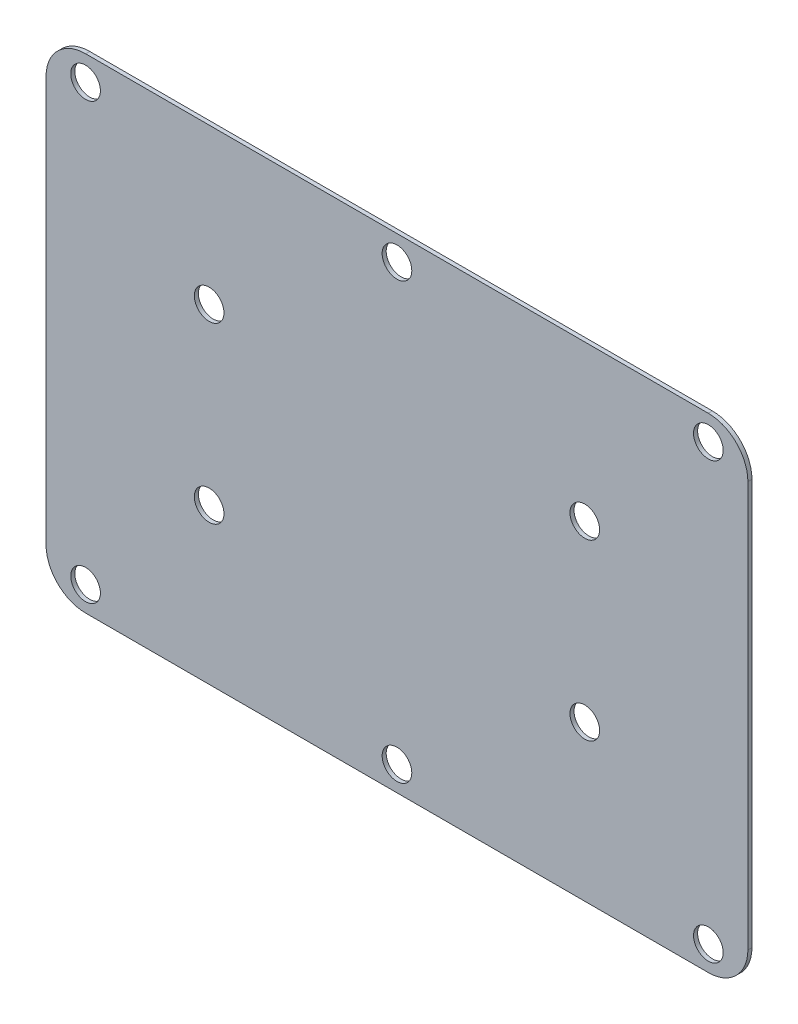
ISO-10303-21;
HEADER;
FILE_DESCRIPTION(('STEP AP214'),'2;1');
FILE_NAME('part.step','',(''),(''),'','','');
FILE_SCHEMA(('AUTOMOTIVE_DESIGN { 1 0 10303 214 1 1 1 1 }'));
ENDSEC;
DATA;
#1=APPLICATION_CONTEXT('core data for automotive mechanical design processes');
#2=APPLICATION_PROTOCOL_DEFINITION('international standard','automotive_design',2000,#1);
#3=PRODUCT_CONTEXT('',#1,'mechanical');
#4=PRODUCT('Part','Part','',(#3));
#5=PRODUCT_RELATED_PRODUCT_CATEGORY('part','',(#4));
#6=PRODUCT_DEFINITION_FORMATION('','',#4);
#7=PRODUCT_DEFINITION_CONTEXT('part definition',#1,'design');
#8=PRODUCT_DEFINITION('design','',#6,#7);
#9=PRODUCT_DEFINITION_SHAPE('','',#8);
#10=(LENGTH_UNIT() NAMED_UNIT(*) SI_UNIT(.MILLI.,.METRE.));
#11=(NAMED_UNIT(*) PLANE_ANGLE_UNIT() SI_UNIT($,.RADIAN.));
#12=(NAMED_UNIT(*) SI_UNIT($,.STERADIAN.) SOLID_ANGLE_UNIT());
#13=UNCERTAINTY_MEASURE_WITH_UNIT(LENGTH_MEASURE(1.E-05),#10,'distance_accuracy_value','');
#14=(GEOMETRIC_REPRESENTATION_CONTEXT(3) GLOBAL_UNCERTAINTY_ASSIGNED_CONTEXT((#13)) GLOBAL_UNIT_ASSIGNED_CONTEXT((#10,
#11,#12)) REPRESENTATION_CONTEXT('',''));
#15=CARTESIAN_POINT('',(0.,0.,0.));
#16=DIRECTION('',(0.,0.,1.));
#17=DIRECTION('',(1.,0.,0.));
#18=AXIS2_PLACEMENT_3D('',#15,#16,#17);
#19=CARTESIAN_POINT('',(-35.5,-20.51300048828,0.));
#20=DIRECTION('',(0.,0.,-1.));
#21=DIRECTION('',(0.,-1.,0.));
#22=AXIS2_PLACEMENT_3D('',#19,#20,#21);
#23=PLANE('',#22);
#24=CARTESIAN_POINT('',(31.5,22.,0.));
#25=DIRECTION('',(0.,0.,1.));
#26=DIRECTION('',(1.,0.,0.));
#27=AXIS2_PLACEMENT_3D('',#24,#25,#26);
#28=CIRCLE('',#27,1.5);
#29=CARTESIAN_POINT('',(33.,22.,0.));
#30=VERTEX_POINT('',#29);
#31=EDGE_CURVE('E30',#30,#30,#28,.T.);
#32=ORIENTED_EDGE('',*,*,#31,.F.);
#33=EDGE_LOOP('',(#32));
#34=FACE_BOUND('',#33,.T.);
#35=CARTESIAN_POINT('',(19.,8.800000190735,0.));
#36=DIRECTION('',(0.,0.,1.));
#37=DIRECTION('',(1.,0.,0.));
#38=AXIS2_PLACEMENT_3D('',#35,#36,#37);
#39=CIRCLE('',#38,1.5);
#40=CARTESIAN_POINT('',(20.5,8.800000190735,0.));
#41=VERTEX_POINT('',#40);
#42=EDGE_CURVE('E220',#41,#41,#39,.T.);
#43=ORIENTED_EDGE('',*,*,#42,.F.);
#44=EDGE_LOOP('',(#43));
#45=FACE_BOUND('',#44,.T.);
#46=CARTESIAN_POINT('',(0.,22.,0.));
#47=DIRECTION('',(0.,0.,1.));
#48=DIRECTION('',(1.,0.,0.));
#49=AXIS2_PLACEMENT_3D('',#46,#47,#48);
#50=CIRCLE('',#49,1.5);
#51=CARTESIAN_POINT('',(1.5,22.,0.));
#52=VERTEX_POINT('',#51);
#53=EDGE_CURVE('E119',#52,#52,#50,.T.);
#54=ORIENTED_EDGE('',*,*,#53,.F.);
#55=EDGE_LOOP('',(#54));
#56=FACE_BOUND('',#55,.T.);
#57=CARTESIAN_POINT('',(31.5,-22.,0.));
#58=DIRECTION('',(0.,0.,1.));
#59=DIRECTION('',(1.,0.,0.));
#60=AXIS2_PLACEMENT_3D('',#57,#58,#59);
#61=CIRCLE('',#60,1.5);
#62=CARTESIAN_POINT('',(33.,-22.,0.));
#63=VERTEX_POINT('',#62);
#64=EDGE_CURVE('E135',#63,#63,#61,.T.);
#65=ORIENTED_EDGE('',*,*,#64,.F.);
#66=EDGE_LOOP('',(#65));
#67=FACE_BOUND('',#66,.T.);
#68=CARTESIAN_POINT('',(19.,-8.800000190735,0.));
#69=DIRECTION('',(0.,0.,1.));
#70=DIRECTION('',(1.,0.,0.));
#71=AXIS2_PLACEMENT_3D('',#68,#69,#70);
#72=CIRCLE('',#71,1.5);
#73=CARTESIAN_POINT('',(20.5,-8.800000190735,0.));
#74=VERTEX_POINT('',#73);
#75=EDGE_CURVE('E333',#74,#74,#72,.T.);
#76=ORIENTED_EDGE('',*,*,#75,.F.);
#77=EDGE_LOOP('',(#76));
#78=FACE_BOUND('',#77,.T.);
#79=CARTESIAN_POINT('',(-19.,8.800000190735,0.));
#80=DIRECTION('',(0.,0.,1.));
#81=DIRECTION('',(1.,0.,0.));
#82=AXIS2_PLACEMENT_3D('',#79,#80,#81);
#83=CIRCLE('',#82,1.5);
#84=CARTESIAN_POINT('',(-17.5,8.800000190735,0.));
#85=VERTEX_POINT('',#84);
#86=EDGE_CURVE('E104',#85,#85,#83,.T.);
#87=ORIENTED_EDGE('',*,*,#86,.F.);
#88=EDGE_LOOP('',(#87));
#89=FACE_BOUND('',#88,.T.);
#90=CARTESIAN_POINT('',(-19.,-8.800000190735,0.));
#91=DIRECTION('',(0.,0.,1.));
#92=DIRECTION('',(1.,0.,0.));
#93=AXIS2_PLACEMENT_3D('',#90,#91,#92);
#94=CIRCLE('',#93,1.5);
#95=CARTESIAN_POINT('',(-17.5,-8.800000190735,0.));
#96=VERTEX_POINT('',#95);
#97=EDGE_CURVE('E197',#96,#96,#94,.T.);
#98=ORIENTED_EDGE('',*,*,#97,.F.);
#99=EDGE_LOOP('',(#98));
#100=FACE_BOUND('',#99,.T.);
#101=CARTESIAN_POINT('',(-31.5,22.,0.));
#102=DIRECTION('',(0.,0.,1.));
#103=DIRECTION('',(1.,0.,0.));
#104=AXIS2_PLACEMENT_3D('',#101,#102,#103);
#105=CIRCLE('',#104,1.5);
#106=CARTESIAN_POINT('',(-30.,22.,0.));
#107=VERTEX_POINT('',#106);
#108=EDGE_CURVE('E231',#107,#107,#105,.T.);
#109=ORIENTED_EDGE('',*,*,#108,.F.);
#110=EDGE_LOOP('',(#109));
#111=FACE_BOUND('',#110,.T.);
#112=CARTESIAN_POINT('',(0.,-22.,0.));
#113=DIRECTION('',(0.,0.,1.));
#114=DIRECTION('',(1.,0.,0.));
#115=AXIS2_PLACEMENT_3D('',#112,#113,#114);
#116=CIRCLE('',#115,1.5);
#117=CARTESIAN_POINT('',(1.5,-22.,0.));
#118=VERTEX_POINT('',#117);
#119=EDGE_CURVE('E176',#118,#118,#116,.T.);
#120=ORIENTED_EDGE('',*,*,#119,.F.);
#121=EDGE_LOOP('',(#120));
#122=FACE_BOUND('',#121,.T.);
#123=CARTESIAN_POINT('',(-31.5,-22.,0.));
#124=DIRECTION('',(0.,0.,1.));
#125=DIRECTION('',(1.,0.,0.));
#126=AXIS2_PLACEMENT_3D('',#123,#124,#125);
#127=CIRCLE('',#126,1.5);
#128=CARTESIAN_POINT('',(-30.,-22.,0.));
#129=VERTEX_POINT('',#128);
#130=EDGE_CURVE('E284',#129,#129,#127,.T.);
#131=ORIENTED_EDGE('',*,*,#130,.F.);
#132=EDGE_LOOP('',(#131));
#133=FACE_BOUND('',#132,.T.);
#134=CARTESIAN_POINT('',(-31.50025073041,-20.50025236553,0.));
#135=DIRECTION('',(0.,0.,1.));
#136=DIRECTION('',(-0.999994920819662,-0.00318721428174392,0.));
#137=AXIS2_PLACEMENT_3D('',#134,#135,#136);
#138=CIRCLE('',#137,3.999769585138);
#139=CARTESIAN_POINT('',(-35.5,-20.51300048828,0.));
#140=VERTEX_POINT('',#139);
#141=CARTESIAN_POINT('',(-31.48699951171,-24.5,0.));
#142=VERTEX_POINT('',#141);
#143=EDGE_CURVE('E285',#140,#142,#138,.T.);
#144=ORIENTED_EDGE('',*,*,#143,.T.);
#145=DIRECTION('',(1.,0.,0.));
#146=VECTOR('',#145,1.);
#147=CARTESIAN_POINT('',(-31.48699951171,-24.5,0.));
#148=LINE('',#147,#146);
#149=CARTESIAN_POINT('',(31.486999511719,-24.5,0.));
#150=VERTEX_POINT('',#149);
#151=EDGE_CURVE('E246',#142,#150,#148,.T.);
#152=ORIENTED_EDGE('',*,*,#151,.T.);
#153=CARTESIAN_POINT('',(31.500250730413,-20.50025236553,0.));
#154=DIRECTION('',(0.,0.,1.));
#155=DIRECTION('',(-0.003312995514305,-0.999994512015302,0.));
#156=AXIS2_PLACEMENT_3D('',#153,#154,#155);
#157=CIRCLE('',#156,3.999769585138);
#158=CARTESIAN_POINT('',(35.5,-20.51300048828,0.));
#159=VERTEX_POINT('',#158);
#160=EDGE_CURVE('E314',#150,#159,#157,.T.);
#161=ORIENTED_EDGE('',*,*,#160,.T.);
#162=DIRECTION('',(0.,1.,0.));
#163=VECTOR('',#162,1.);
#164=CARTESIAN_POINT('',(35.5,-20.51300048828,0.));
#165=LINE('',#164,#163);
#166=CARTESIAN_POINT('',(35.5,20.513000488281,0.));
#167=VERTEX_POINT('',#166);
#168=EDGE_CURVE('E259',#159,#167,#165,.T.);
#169=ORIENTED_EDGE('',*,*,#168,.T.);
#170=CARTESIAN_POINT('',(31.500250730413,20.500252365536,0.));
#171=DIRECTION('',(0.,0.,1.));
#172=DIRECTION('',(0.999994920819662,0.00318721428174392,0.));
#173=AXIS2_PLACEMENT_3D('',#170,#171,#172);
#174=CIRCLE('',#173,3.999769585138);
#175=CARTESIAN_POINT('',(31.486999511719,24.5,0.));
#176=VERTEX_POINT('',#175);
#177=EDGE_CURVE('E215',#167,#176,#174,.T.);
#178=ORIENTED_EDGE('',*,*,#177,.T.);
#179=DIRECTION('',(-1.,0.,0.));
#180=VECTOR('',#179,1.);
#181=CARTESIAN_POINT('',(31.486999511719,24.5,0.));
#182=LINE('',#181,#180);
#183=CARTESIAN_POINT('',(-31.48699951171,24.5,0.));
#184=VERTEX_POINT('',#183);
#185=EDGE_CURVE('E270',#176,#184,#182,.T.);
#186=ORIENTED_EDGE('',*,*,#185,.T.);
#187=CARTESIAN_POINT('',(-31.50025073041,20.500252365536,0.));
#188=DIRECTION('',(0.,0.,1.));
#189=DIRECTION('',(0.003312995514305,0.999994512015302,0.));
#190=AXIS2_PLACEMENT_3D('',#187,#188,#189);
#191=CIRCLE('',#190,3.999769585138);
#192=CARTESIAN_POINT('',(-35.5,20.513000488281,0.));
#193=VERTEX_POINT('',#192);
#194=EDGE_CURVE('E226',#184,#193,#191,.T.);
#195=ORIENTED_EDGE('',*,*,#194,.T.);
#196=DIRECTION('',(0.,-1.,0.));
#197=VECTOR('',#196,1.);
#198=CARTESIAN_POINT('',(-35.5,20.513000488281,0.));
#199=LINE('',#198,#197);
#200=EDGE_CURVE('E225',#193,#140,#199,.T.);
#201=ORIENTED_EDGE('',*,*,#200,.T.);
#202=EDGE_LOOP('',(#144,#152,#161,#169,#178,#186,#195,#201));
#203=FACE_BOUND('',#202,.T.);
#204=ADVANCED_FACE('F19',(#34,#45,#56,#67,#78,#89,#100,#111,#122,#133,#203),#23,.F.);
#205=CARTESIAN_POINT('',(-35.5,-20.51300048828,-0.41148));
#206=DIRECTION('',(0.,0.,-1.));
#207=DIRECTION('',(0.,-1.,0.));
#208=AXIS2_PLACEMENT_3D('',#205,#206,#207);
#209=PLANE('',#208);
#210=CARTESIAN_POINT('',(31.5,22.,-0.41148));
#211=DIRECTION('',(0.,0.,1.));
#212=DIRECTION('',(1.,0.,0.));
#213=AXIS2_PLACEMENT_3D('',#210,#211,#212);
#214=CIRCLE('',#213,1.5);
#215=CARTESIAN_POINT('',(33.,22.,-0.41148));
#216=VERTEX_POINT('',#215);
#217=EDGE_CURVE('E11',#216,#216,#214,.T.);
#218=ORIENTED_EDGE('',*,*,#217,.T.);
#219=EDGE_LOOP('',(#218));
#220=FACE_BOUND('',#219,.T.);
#221=CARTESIAN_POINT('',(19.,8.800000190735,-0.41148));
#222=DIRECTION('',(0.,0.,1.));
#223=DIRECTION('',(1.,0.,0.));
#224=AXIS2_PLACEMENT_3D('',#221,#222,#223);
#225=CIRCLE('',#224,1.5);
#226=CARTESIAN_POINT('',(20.5,8.800000190735,-0.41148));
#227=VERTEX_POINT('',#226);
#228=EDGE_CURVE('E251',#227,#227,#225,.T.);
#229=ORIENTED_EDGE('',*,*,#228,.T.);
#230=EDGE_LOOP('',(#229));
#231=FACE_BOUND('',#230,.T.);
#232=CARTESIAN_POINT('',(0.,22.,-0.41148));
#233=DIRECTION('',(0.,0.,1.));
#234=DIRECTION('',(1.,0.,0.));
#235=AXIS2_PLACEMENT_3D('',#232,#233,#234);
#236=CIRCLE('',#235,1.5);
#237=CARTESIAN_POINT('',(1.5,22.,-0.41148));
#238=VERTEX_POINT('',#237);
#239=EDGE_CURVE('E128',#238,#238,#236,.T.);
#240=ORIENTED_EDGE('',*,*,#239,.T.);
#241=EDGE_LOOP('',(#240));
#242=FACE_BOUND('',#241,.T.);
#243=CARTESIAN_POINT('',(31.5,-22.,-0.41148));
#244=DIRECTION('',(0.,0.,1.));
#245=DIRECTION('',(1.,0.,0.));
#246=AXIS2_PLACEMENT_3D('',#243,#244,#245);
#247=CIRCLE('',#246,1.5);
#248=CARTESIAN_POINT('',(33.,-22.,-0.41148));
#249=VERTEX_POINT('',#248);
#250=EDGE_CURVE('E23',#249,#249,#247,.T.);
#251=ORIENTED_EDGE('',*,*,#250,.T.);
#252=EDGE_LOOP('',(#251));
#253=FACE_BOUND('',#252,.T.);
#254=CARTESIAN_POINT('',(19.,-8.800000190735,-0.41148));
#255=DIRECTION('',(0.,0.,1.));
#256=DIRECTION('',(1.,0.,0.));
#257=AXIS2_PLACEMENT_3D('',#254,#255,#256);
#258=CIRCLE('',#257,1.5);
#259=CARTESIAN_POINT('',(20.5,-8.800000190735,-0.41148));
#260=VERTEX_POINT('',#259);
#261=EDGE_CURVE('E93',#260,#260,#258,.T.);
#262=ORIENTED_EDGE('',*,*,#261,.T.);
#263=EDGE_LOOP('',(#262));
#264=FACE_BOUND('',#263,.T.);
#265=CARTESIAN_POINT('',(-19.,8.800000190735,-0.41148));
#266=DIRECTION('',(0.,0.,1.));
#267=DIRECTION('',(1.,0.,0.));
#268=AXIS2_PLACEMENT_3D('',#265,#266,#267);
#269=CIRCLE('',#268,1.5);
#270=CARTESIAN_POINT('',(-17.5,8.800000190735,-0.41148));
#271=VERTEX_POINT('',#270);
#272=EDGE_CURVE('E289',#271,#271,#269,.T.);
#273=ORIENTED_EDGE('',*,*,#272,.T.);
#274=EDGE_LOOP('',(#273));
#275=FACE_BOUND('',#274,.T.);
#276=CARTESIAN_POINT('',(-19.,-8.800000190735,-0.41148));
#277=DIRECTION('',(0.,0.,1.));
#278=DIRECTION('',(1.,0.,0.));
#279=AXIS2_PLACEMENT_3D('',#276,#277,#278);
#280=CIRCLE('',#279,1.5);
#281=CARTESIAN_POINT('',(-17.5,-8.800000190735,-0.41148));
#282=VERTEX_POINT('',#281);
#283=EDGE_CURVE('E190',#282,#282,#280,.T.);
#284=ORIENTED_EDGE('',*,*,#283,.T.);
#285=EDGE_LOOP('',(#284));
#286=FACE_BOUND('',#285,.T.);
#287=CARTESIAN_POINT('',(-31.5,22.,-0.41148));
#288=DIRECTION('',(0.,0.,1.));
#289=DIRECTION('',(1.,0.,0.));
#290=AXIS2_PLACEMENT_3D('',#287,#288,#289);
#291=CIRCLE('',#290,1.5);
#292=CARTESIAN_POINT('',(-30.,22.,-0.41148));
#293=VERTEX_POINT('',#292);
#294=EDGE_CURVE('E162',#293,#293,#291,.T.);
#295=ORIENTED_EDGE('',*,*,#294,.T.);
#296=EDGE_LOOP('',(#295));
#297=FACE_BOUND('',#296,.T.);
#298=CARTESIAN_POINT('',(0.,-22.,-0.41148));
#299=DIRECTION('',(0.,0.,1.));
#300=DIRECTION('',(1.,0.,0.));
#301=AXIS2_PLACEMENT_3D('',#298,#299,#300);
#302=CIRCLE('',#301,1.5);
#303=CARTESIAN_POINT('',(1.5,-22.,-0.41148));
#304=VERTEX_POINT('',#303);
#305=EDGE_CURVE('E232',#304,#304,#302,.T.);
#306=ORIENTED_EDGE('',*,*,#305,.T.);
#307=EDGE_LOOP('',(#306));
#308=FACE_BOUND('',#307,.T.);
#309=CARTESIAN_POINT('',(-31.5,-22.,-0.41148));
#310=DIRECTION('',(0.,0.,1.));
#311=DIRECTION('',(1.,0.,0.));
#312=AXIS2_PLACEMENT_3D('',#309,#310,#311);
#313=CIRCLE('',#312,1.5);
#314=CARTESIAN_POINT('',(-30.,-22.,-0.41148));
#315=VERTEX_POINT('',#314);
#316=EDGE_CURVE('E239',#315,#315,#313,.T.);
#317=ORIENTED_EDGE('',*,*,#316,.T.);
#318=EDGE_LOOP('',(#317));
#319=FACE_BOUND('',#318,.T.);
#320=DIRECTION('',(0.,-1.,0.));
#321=VECTOR('',#320,1.);
#322=CARTESIAN_POINT('',(-35.5,20.513000488281,-0.41148));
#323=LINE('',#322,#321);
#324=CARTESIAN_POINT('',(-35.5,20.513000488281,-0.41148));
#325=VERTEX_POINT('',#324);
#326=CARTESIAN_POINT('',(-35.5,-20.51300048828,-0.41148));
#327=VERTEX_POINT('',#326);
#328=EDGE_CURVE('E221',#325,#327,#323,.T.);
#329=ORIENTED_EDGE('',*,*,#328,.F.);
#330=CARTESIAN_POINT('',(-31.50025073041,20.500252365536,-0.41148));
#331=DIRECTION('',(0.,0.,1.));
#332=DIRECTION('',(0.003312995514305,0.999994512015302,0.));
#333=AXIS2_PLACEMENT_3D('',#330,#331,#332);
#334=CIRCLE('',#333,3.999769585138);
#335=CARTESIAN_POINT('',(-31.48699951171,24.5,-0.41148));
#336=VERTEX_POINT('',#335);
#337=EDGE_CURVE('E265',#336,#325,#334,.T.);
#338=ORIENTED_EDGE('',*,*,#337,.F.);
#339=DIRECTION('',(-1.,0.,0.));
#340=VECTOR('',#339,1.);
#341=CARTESIAN_POINT('',(31.486999511719,24.5,-0.41148));
#342=LINE('',#341,#340);
#343=CARTESIAN_POINT('',(31.486999511719,24.5,-0.41148));
#344=VERTEX_POINT('',#343);
#345=EDGE_CURVE('E211',#344,#336,#342,.T.);
#346=ORIENTED_EDGE('',*,*,#345,.F.);
#347=CARTESIAN_POINT('',(31.500250730413,20.500252365536,-0.41148));
#348=DIRECTION('',(0.,0.,1.));
#349=DIRECTION('',(0.999994920819662,0.00318721428174392,0.));
#350=AXIS2_PLACEMENT_3D('',#347,#348,#349);
#351=CIRCLE('',#350,3.999769585138);
#352=CARTESIAN_POINT('',(35.5,20.513000488281,-0.41148));
#353=VERTEX_POINT('',#352);
#354=EDGE_CURVE('E264',#353,#344,#351,.T.);
#355=ORIENTED_EDGE('',*,*,#354,.F.);
#356=DIRECTION('',(0.,1.,0.));
#357=VECTOR('',#356,1.);
#358=CARTESIAN_POINT('',(35.5,-20.51300048828,-0.41148));
#359=LINE('',#358,#357);
#360=CARTESIAN_POINT('',(35.5,-20.51300048828,-0.41148));
#361=VERTEX_POINT('',#360);
#362=EDGE_CURVE('E260',#361,#353,#359,.T.);
#363=ORIENTED_EDGE('',*,*,#362,.F.);
#364=CARTESIAN_POINT('',(31.500250730413,-20.50025236553,-0.41148));
#365=DIRECTION('',(0.,0.,1.));
#366=DIRECTION('',(-0.003312995514305,-0.999994512015302,0.));
#367=AXIS2_PLACEMENT_3D('',#364,#365,#366);
#368=CIRCLE('',#367,3.999769585138);
#369=CARTESIAN_POINT('',(31.486999511719,-24.5,-0.41148));
#370=VERTEX_POINT('',#369);
#371=EDGE_CURVE('E315',#370,#361,#368,.T.);
#372=ORIENTED_EDGE('',*,*,#371,.F.);
#373=DIRECTION('',(1.,0.,0.));
#374=VECTOR('',#373,1.);
#375=CARTESIAN_POINT('',(-31.48699951171,-24.5,-0.41148));
#376=LINE('',#375,#374);
#377=CARTESIAN_POINT('',(-31.48699951171,-24.5,-0.41148));
#378=VERTEX_POINT('',#377);
#379=EDGE_CURVE('E247',#378,#370,#376,.T.);
#380=ORIENTED_EDGE('',*,*,#379,.F.);
#381=CARTESIAN_POINT('',(-31.50025073041,-20.50025236553,-0.41148));
#382=DIRECTION('',(0.,0.,1.));
#383=DIRECTION('',(-0.999994920819662,-0.00318721428174392,0.));
#384=AXIS2_PLACEMENT_3D('',#381,#382,#383);
#385=CIRCLE('',#384,3.999769585138);
#386=EDGE_CURVE('E276',#327,#378,#385,.T.);
#387=ORIENTED_EDGE('',*,*,#386,.F.);
#388=EDGE_LOOP('',(#329,#338,#346,#355,#363,#372,#380,#387));
#389=FACE_BOUND('',#388,.T.);
#390=ADVANCED_FACE('F191',(#220,#231,#242,#253,#264,#275,#286,#297,#308,#319,#389),#209,.T.);
#391=CARTESIAN_POINT('',(31.5,22.,-0.41148));
#392=DIRECTION('',(0.,0.,-1.));
#393=DIRECTION('',(1.,0.,0.));
#394=AXIS2_PLACEMENT_3D('',#391,#392,#393);
#395=CYLINDRICAL_SURFACE('',#394,1.5);
#396=DIRECTION('',(0.,0.,1.));
#397=VECTOR('',#396,1.);
#398=CARTESIAN_POINT('',(33.,22.,-0.41148));
#399=LINE('',#398,#397);
#400=EDGE_CURVE('E248',#216,#30,#399,.T.);
#401=ORIENTED_EDGE('',*,*,#400,.T.);
#402=ORIENTED_EDGE('',*,*,#31,.T.);
#403=ORIENTED_EDGE('',*,*,#400,.F.);
#404=ORIENTED_EDGE('',*,*,#217,.F.);
#405=EDGE_LOOP('',(#401,#402,#403,#404));
#406=FACE_BOUND('',#405,.T.);
#407=ADVANCED_FACE('F478',(#406),#395,.F.);
#408=CARTESIAN_POINT('',(19.,8.800000190735,-0.41148));
#409=DIRECTION('',(0.,0.,-1.));
#410=DIRECTION('',(1.,0.,0.));
#411=AXIS2_PLACEMENT_3D('',#408,#409,#410);
#412=CYLINDRICAL_SURFACE('',#411,1.5);
#413=DIRECTION('',(0.,0.,1.));
#414=VECTOR('',#413,1.);
#415=CARTESIAN_POINT('',(20.5,8.800000190735,-0.41148));
#416=LINE('',#415,#414);
#417=EDGE_CURVE('E216',#227,#41,#416,.T.);
#418=ORIENTED_EDGE('',*,*,#417,.T.);
#419=ORIENTED_EDGE('',*,*,#42,.T.);
#420=ORIENTED_EDGE('',*,*,#417,.F.);
#421=ORIENTED_EDGE('',*,*,#228,.F.);
#422=EDGE_LOOP('',(#418,#419,#420,#421));
#423=FACE_BOUND('',#422,.T.);
#424=ADVANCED_FACE('F474',(#423),#412,.F.);
#425=CARTESIAN_POINT('',(0.,22.,-0.41148));
#426=DIRECTION('',(0.,0.,-1.));
#427=DIRECTION('',(1.,0.,0.));
#428=AXIS2_PLACEMENT_3D('',#425,#426,#427);
#429=CYLINDRICAL_SURFACE('',#428,1.5);
#430=DIRECTION('',(0.,0.,1.));
#431=VECTOR('',#430,1.);
#432=CARTESIAN_POINT('',(1.5,22.,-0.41148));
#433=LINE('',#432,#431);
#434=EDGE_CURVE('E331',#238,#52,#433,.T.);
#435=ORIENTED_EDGE('',*,*,#434,.T.);
#436=ORIENTED_EDGE('',*,*,#53,.T.);
#437=ORIENTED_EDGE('',*,*,#434,.F.);
#438=ORIENTED_EDGE('',*,*,#239,.F.);
#439=EDGE_LOOP('',(#435,#436,#437,#438));
#440=FACE_BOUND('',#439,.T.);
#441=ADVANCED_FACE('F477',(#440),#429,.F.);
#442=CARTESIAN_POINT('',(31.5,-22.,-0.41148));
#443=DIRECTION('',(0.,0.,-1.));
#444=DIRECTION('',(1.,0.,0.));
#445=AXIS2_PLACEMENT_3D('',#442,#443,#444);
#446=CYLINDRICAL_SURFACE('',#445,1.5);
#447=DIRECTION('',(0.,0.,1.));
#448=VECTOR('',#447,1.);
#449=CARTESIAN_POINT('',(33.,-22.,-0.41148));
#450=LINE('',#449,#448);
#451=EDGE_CURVE('E252',#249,#63,#450,.T.);
#452=ORIENTED_EDGE('',*,*,#451,.T.);
#453=ORIENTED_EDGE('',*,*,#64,.T.);
#454=ORIENTED_EDGE('',*,*,#451,.F.);
#455=ORIENTED_EDGE('',*,*,#250,.F.);
#456=EDGE_LOOP('',(#452,#453,#454,#455));
#457=FACE_BOUND('',#456,.T.);
#458=ADVANCED_FACE('F487',(#457),#446,.F.);
#459=CARTESIAN_POINT('',(19.,-8.800000190735,-0.41148));
#460=DIRECTION('',(0.,0.,-1.));
#461=DIRECTION('',(1.,0.,0.));
#462=AXIS2_PLACEMENT_3D('',#459,#460,#461);
#463=CYLINDRICAL_SURFACE('',#462,1.5);
#464=DIRECTION('',(0.,0.,1.));
#465=VECTOR('',#464,1.);
#466=CARTESIAN_POINT('',(20.5,-8.800000190735,-0.41148));
#467=LINE('',#466,#465);
#468=EDGE_CURVE('E292',#260,#74,#467,.T.);
#469=ORIENTED_EDGE('',*,*,#468,.T.);
#470=ORIENTED_EDGE('',*,*,#75,.T.);
#471=ORIENTED_EDGE('',*,*,#468,.F.);
#472=ORIENTED_EDGE('',*,*,#261,.F.);
#473=EDGE_LOOP('',(#469,#470,#471,#472));
#474=FACE_BOUND('',#473,.T.);
#475=ADVANCED_FACE('F21',(#474),#463,.F.);
#476=CARTESIAN_POINT('',(-19.,8.800000190735,-0.41148));
#477=DIRECTION('',(0.,0.,-1.));
#478=DIRECTION('',(1.,0.,0.));
#479=AXIS2_PLACEMENT_3D('',#476,#477,#478);
#480=CYLINDRICAL_SURFACE('',#479,1.5);
#481=DIRECTION('',(0.,0.,1.));
#482=VECTOR('',#481,1.);
#483=CARTESIAN_POINT('',(-17.5,8.800000190735,-0.41148));
#484=LINE('',#483,#482);
#485=EDGE_CURVE('E196',#271,#85,#484,.T.);
#486=ORIENTED_EDGE('',*,*,#485,.T.);
#487=ORIENTED_EDGE('',*,*,#86,.T.);
#488=ORIENTED_EDGE('',*,*,#485,.F.);
#489=ORIENTED_EDGE('',*,*,#272,.F.);
#490=EDGE_LOOP('',(#486,#487,#488,#489));
#491=FACE_BOUND('',#490,.T.);
#492=ADVANCED_FACE('F481',(#491),#480,.F.);
#493=CARTESIAN_POINT('',(-19.,-8.800000190735,-0.41148));
#494=DIRECTION('',(0.,0.,-1.));
#495=DIRECTION('',(1.,0.,0.));
#496=AXIS2_PLACEMENT_3D('',#493,#494,#495);
#497=CYLINDRICAL_SURFACE('',#496,1.5);
#498=DIRECTION('',(0.,0.,1.));
#499=VECTOR('',#498,1.);
#500=CARTESIAN_POINT('',(-17.5,-8.800000190735,-0.41148));
#501=LINE('',#500,#499);
#502=EDGE_CURVE('E205',#282,#96,#501,.T.);
#503=ORIENTED_EDGE('',*,*,#502,.T.);
#504=ORIENTED_EDGE('',*,*,#97,.T.);
#505=ORIENTED_EDGE('',*,*,#502,.F.);
#506=ORIENTED_EDGE('',*,*,#283,.F.);
#507=EDGE_LOOP('',(#503,#504,#505,#506));
#508=FACE_BOUND('',#507,.T.);
#509=ADVANCED_FACE('F483',(#508),#497,.F.);
#510=CARTESIAN_POINT('',(-31.5,22.,-0.41148));
#511=DIRECTION('',(0.,0.,-1.));
#512=DIRECTION('',(1.,0.,0.));
#513=AXIS2_PLACEMENT_3D('',#510,#511,#512);
#514=CYLINDRICAL_SURFACE('',#513,1.5);
#515=DIRECTION('',(0.,0.,1.));
#516=VECTOR('',#515,1.);
#517=CARTESIAN_POINT('',(-30.,22.,-0.41148));
#518=LINE('',#517,#516);
#519=EDGE_CURVE('E227',#293,#107,#518,.T.);
#520=ORIENTED_EDGE('',*,*,#519,.T.);
#521=ORIENTED_EDGE('',*,*,#108,.T.);
#522=ORIENTED_EDGE('',*,*,#519,.F.);
#523=ORIENTED_EDGE('',*,*,#294,.F.);
#524=EDGE_LOOP('',(#520,#521,#522,#523));
#525=FACE_BOUND('',#524,.T.);
#526=ADVANCED_FACE('F493',(#525),#514,.F.);
#527=CARTESIAN_POINT('',(0.,-22.,-0.41148));
#528=DIRECTION('',(0.,0.,-1.));
#529=DIRECTION('',(1.,0.,0.));
#530=AXIS2_PLACEMENT_3D('',#527,#528,#529);
#531=CYLINDRICAL_SURFACE('',#530,1.5);
#532=DIRECTION('',(0.,0.,1.));
#533=VECTOR('',#532,1.);
#534=CARTESIAN_POINT('',(1.5,-22.,-0.41148));
#535=LINE('',#534,#533);
#536=EDGE_CURVE('E236',#304,#118,#535,.T.);
#537=ORIENTED_EDGE('',*,*,#536,.T.);
#538=ORIENTED_EDGE('',*,*,#119,.T.);
#539=ORIENTED_EDGE('',*,*,#536,.F.);
#540=ORIENTED_EDGE('',*,*,#305,.F.);
#541=EDGE_LOOP('',(#537,#538,#539,#540));
#542=FACE_BOUND('',#541,.T.);
#543=ADVANCED_FACE('F496',(#542),#531,.F.);
#544=CARTESIAN_POINT('',(-31.5,-22.,-0.41148));
#545=DIRECTION('',(0.,0.,-1.));
#546=DIRECTION('',(1.,0.,0.));
#547=AXIS2_PLACEMENT_3D('',#544,#545,#546);
#548=CYLINDRICAL_SURFACE('',#547,1.5);
#549=DIRECTION('',(0.,0.,1.));
#550=VECTOR('',#549,1.);
#551=CARTESIAN_POINT('',(-30.,-22.,-0.41148));
#552=LINE('',#551,#550);
#553=EDGE_CURVE('E235',#315,#129,#552,.T.);
#554=ORIENTED_EDGE('',*,*,#553,.T.);
#555=ORIENTED_EDGE('',*,*,#130,.T.);
#556=ORIENTED_EDGE('',*,*,#553,.F.);
#557=ORIENTED_EDGE('',*,*,#316,.F.);
#558=EDGE_LOOP('',(#554,#555,#556,#557));
#559=FACE_BOUND('',#558,.T.);
#560=ADVANCED_FACE('F489',(#559),#548,.F.);
#561=CARTESIAN_POINT('',(-35.5,20.513000488281,-0.41148));
#562=DIRECTION('',(1.,0.,0.));
#563=DIRECTION('',(0.,1.,0.));
#564=AXIS2_PLACEMENT_3D('',#561,#562,#563);
#565=PLANE('',#564);
#566=ORIENTED_EDGE('',*,*,#328,.T.);
#567=DIRECTION('',(0.,0.,1.));
#568=VECTOR('',#567,1.);
#569=CARTESIAN_POINT('',(-35.5,-20.51300048828,-0.41148));
#570=LINE('',#569,#568);
#571=EDGE_CURVE('E209',#327,#140,#570,.T.);
#572=ORIENTED_EDGE('',*,*,#571,.T.);
#573=ORIENTED_EDGE('',*,*,#200,.F.);
#574=DIRECTION('',(0.,0.,1.));
#575=VECTOR('',#574,1.);
#576=CARTESIAN_POINT('',(-35.5,20.513000488281,-0.41148));
#577=LINE('',#576,#575);
#578=EDGE_CURVE('E269',#325,#193,#577,.T.);
#579=ORIENTED_EDGE('',*,*,#578,.F.);
#580=EDGE_LOOP('',(#566,#572,#573,#579));
#581=FACE_BOUND('',#580,.T.);
#582=ADVANCED_FACE('F446',(#581),#565,.F.);
#583=CARTESIAN_POINT('',(-31.50025073041,20.500252365536,-0.41148));
#584=DIRECTION('',(0.,0.,-1.));
#585=DIRECTION('',(0.003312995514305,0.999994512015302,0.));
#586=AXIS2_PLACEMENT_3D('',#583,#584,#585);
#587=CYLINDRICAL_SURFACE('',#586,3.999769585138);
#588=ORIENTED_EDGE('',*,*,#337,.T.);
#589=ORIENTED_EDGE('',*,*,#578,.T.);
#590=ORIENTED_EDGE('',*,*,#194,.F.);
#591=DIRECTION('',(0.,0.,1.));
#592=VECTOR('',#591,1.);
#593=CARTESIAN_POINT('',(-31.48699951171,24.5,-0.41148));
#594=LINE('',#593,#592);
#595=EDGE_CURVE('E214',#336,#184,#594,.T.);
#596=ORIENTED_EDGE('',*,*,#595,.F.);
#597=EDGE_LOOP('',(#588,#589,#590,#596));
#598=FACE_BOUND('',#597,.T.);
#599=ADVANCED_FACE('F448',(#598),#587,.T.);
#600=CARTESIAN_POINT('',(31.486999511719,24.5,-0.41148));
#601=DIRECTION('',(0.,-1.,0.));
#602=DIRECTION('',(0.,0.,-1.));
#603=AXIS2_PLACEMENT_3D('',#600,#601,#602);
#604=PLANE('',#603);
#605=ORIENTED_EDGE('',*,*,#345,.T.);
#606=ORIENTED_EDGE('',*,*,#595,.T.);
#607=ORIENTED_EDGE('',*,*,#185,.F.);
#608=DIRECTION('',(0.,0.,1.));
#609=VECTOR('',#608,1.);
#610=CARTESIAN_POINT('',(31.486999511719,24.5,-0.41148));
#611=LINE('',#610,#609);
#612=EDGE_CURVE('E307',#344,#176,#611,.T.);
#613=ORIENTED_EDGE('',*,*,#612,.F.);
#614=EDGE_LOOP('',(#605,#606,#607,#613));
#615=FACE_BOUND('',#614,.T.);
#616=ADVANCED_FACE('F452',(#615),#604,.F.);
#617=CARTESIAN_POINT('',(31.500250730413,20.500252365536,-0.41148));
#618=DIRECTION('',(0.,0.,-1.));
#619=DIRECTION('',(0.999994920819662,0.00318721428174392,0.));
#620=AXIS2_PLACEMENT_3D('',#617,#618,#619);
#621=CYLINDRICAL_SURFACE('',#620,3.999769585138);
#622=ORIENTED_EDGE('',*,*,#354,.T.);
#623=ORIENTED_EDGE('',*,*,#612,.T.);
#624=ORIENTED_EDGE('',*,*,#177,.F.);
#625=DIRECTION('',(0.,0.,1.));
#626=VECTOR('',#625,1.);
#627=CARTESIAN_POINT('',(35.5,20.513000488281,-0.41148));
#628=LINE('',#627,#626);
#629=EDGE_CURVE('E255',#353,#167,#628,.T.);
#630=ORIENTED_EDGE('',*,*,#629,.F.);
#631=EDGE_LOOP('',(#622,#623,#624,#630));
#632=FACE_BOUND('',#631,.T.);
#633=ADVANCED_FACE('F455',(#632),#621,.T.);
#634=CARTESIAN_POINT('',(35.5,-20.51300048828,-0.41148));
#635=DIRECTION('',(-1.,0.,0.));
#636=DIRECTION('',(0.,0.,1.));
#637=AXIS2_PLACEMENT_3D('',#634,#635,#636);
#638=PLANE('',#637);
#639=ORIENTED_EDGE('',*,*,#362,.T.);
#640=ORIENTED_EDGE('',*,*,#629,.T.);
#641=ORIENTED_EDGE('',*,*,#168,.F.);
#642=DIRECTION('',(0.,0.,1.));
#643=VECTOR('',#642,1.);
#644=CARTESIAN_POINT('',(35.5,-20.51300048828,-0.41148));
#645=LINE('',#644,#643);
#646=EDGE_CURVE('E311',#361,#159,#645,.T.);
#647=ORIENTED_EDGE('',*,*,#646,.F.);
#648=EDGE_LOOP('',(#639,#640,#641,#647));
#649=FACE_BOUND('',#648,.T.);
#650=ADVANCED_FACE('F456',(#649),#638,.F.);
#651=CARTESIAN_POINT('',(31.500250730413,-20.50025236553,-0.41148));
#652=DIRECTION('',(0.,0.,-1.));
#653=DIRECTION('',(-0.003312995514305,-0.999994512015302,0.));
#654=AXIS2_PLACEMENT_3D('',#651,#652,#653);
#655=CYLINDRICAL_SURFACE('',#654,3.999769585138);
#656=ORIENTED_EDGE('',*,*,#371,.T.);
#657=ORIENTED_EDGE('',*,*,#646,.T.);
#658=ORIENTED_EDGE('',*,*,#160,.F.);
#659=DIRECTION('',(0.,0.,1.));
#660=VECTOR('',#659,1.);
#661=CARTESIAN_POINT('',(31.486999511719,-24.5,-0.41148));
#662=LINE('',#661,#660);
#663=EDGE_CURVE('E242',#370,#150,#662,.T.);
#664=ORIENTED_EDGE('',*,*,#663,.F.);
#665=EDGE_LOOP('',(#656,#657,#658,#664));
#666=FACE_BOUND('',#665,.T.);
#667=ADVANCED_FACE('F459',(#666),#655,.T.);
#668=CARTESIAN_POINT('',(-31.48699951171,-24.5,-0.41148));
#669=DIRECTION('',(0.,1.,0.));
#670=DIRECTION('',(1.,0.,0.));
#671=AXIS2_PLACEMENT_3D('',#668,#669,#670);
#672=PLANE('',#671);
#673=ORIENTED_EDGE('',*,*,#379,.T.);
#674=ORIENTED_EDGE('',*,*,#663,.T.);
#675=ORIENTED_EDGE('',*,*,#151,.F.);
#676=DIRECTION('',(0.,0.,1.));
#677=VECTOR('',#676,1.);
#678=CARTESIAN_POINT('',(-31.48699951171,-24.5,-0.41148));
#679=LINE('',#678,#677);
#680=EDGE_CURVE('E280',#378,#142,#679,.T.);
#681=ORIENTED_EDGE('',*,*,#680,.F.);
#682=EDGE_LOOP('',(#673,#674,#675,#681));
#683=FACE_BOUND('',#682,.T.);
#684=ADVANCED_FACE('F414',(#683),#672,.F.);
#685=CARTESIAN_POINT('',(-31.50025073041,-20.50025236553,-0.41148));
#686=DIRECTION('',(0.,0.,-1.));
#687=DIRECTION('',(-0.999994920819662,-0.00318721428174392,0.));
#688=AXIS2_PLACEMENT_3D('',#685,#686,#687);
#689=CYLINDRICAL_SURFACE('',#688,3.999769585138);
#690=ORIENTED_EDGE('',*,*,#386,.T.);
#691=ORIENTED_EDGE('',*,*,#680,.T.);
#692=ORIENTED_EDGE('',*,*,#143,.F.);
#693=ORIENTED_EDGE('',*,*,#571,.F.);
#694=EDGE_LOOP('',(#690,#691,#692,#693));
#695=FACE_BOUND('',#694,.T.);
#696=ADVANCED_FACE('F411',(#695),#689,.T.);
#697=CLOSED_SHELL('',(#204,#390,#407,#424,#441,#458,#475,#492,#509,#526,#543,#560,#582,#599,
#616,#633,#650,#667,#684,#696));
#698=MANIFOLD_SOLID_BREP('B1',#697);
#699=ADVANCED_BREP_SHAPE_REPRESENTATION('',(#18,#698),#14);
#700=SHAPE_DEFINITION_REPRESENTATION(#9,#699);
ENDSEC;
END-ISO-10303-21;
